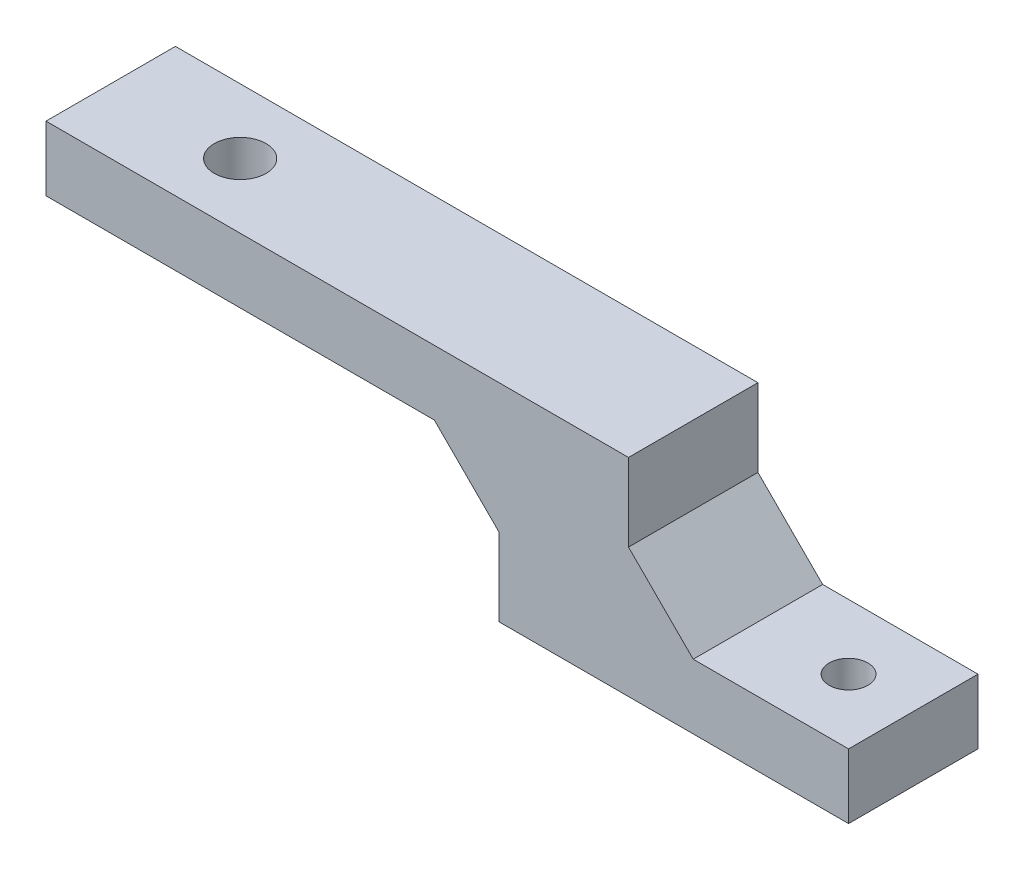
ISO-10303-21;
HEADER;
FILE_DESCRIPTION(('STEP AP214'),'2;1');
FILE_NAME('part.step','',(''),(''),'','','');
FILE_SCHEMA(('AUTOMOTIVE_DESIGN { 1 0 10303 214 1 1 1 1 }'));
ENDSEC;
DATA;
#1=APPLICATION_CONTEXT('core data for automotive mechanical design processes');
#2=APPLICATION_PROTOCOL_DEFINITION('international standard','automotive_design',2000,#1);
#3=PRODUCT_CONTEXT('',#1,'mechanical');
#4=PRODUCT('Part','Part','',(#3));
#5=PRODUCT_RELATED_PRODUCT_CATEGORY('part','',(#4));
#6=PRODUCT_DEFINITION_FORMATION('','',#4);
#7=PRODUCT_DEFINITION_CONTEXT('part definition',#1,'design');
#8=PRODUCT_DEFINITION('design','',#6,#7);
#9=PRODUCT_DEFINITION_SHAPE('','',#8);
#10=(LENGTH_UNIT() NAMED_UNIT(*) SI_UNIT(.MILLI.,.METRE.));
#11=(NAMED_UNIT(*) PLANE_ANGLE_UNIT() SI_UNIT($,.RADIAN.));
#12=(NAMED_UNIT(*) SI_UNIT($,.STERADIAN.) SOLID_ANGLE_UNIT());
#13=UNCERTAINTY_MEASURE_WITH_UNIT(LENGTH_MEASURE(1.E-05),#10,'distance_accuracy_value','');
#14=(GEOMETRIC_REPRESENTATION_CONTEXT(3) GLOBAL_UNCERTAINTY_ASSIGNED_CONTEXT((#13)) GLOBAL_UNIT_ASSIGNED_CONTEXT((#10,
#11,#12)) REPRESENTATION_CONTEXT('',''));
#15=CARTESIAN_POINT('',(0.,0.,0.));
#16=DIRECTION('',(0.,0.,1.));
#17=DIRECTION('',(1.,0.,0.));
#18=AXIS2_PLACEMENT_3D('',#15,#16,#17);
#19=CARTESIAN_POINT('',(0.,0.,10.));
#20=DIRECTION('',(1.,0.,0.));
#21=DIRECTION('',(0.,0.,-1.));
#22=AXIS2_PLACEMENT_3D('',#19,#20,#21);
#23=PLANE('',#22);
#24=DIRECTION('',(0.,-1.,0.));
#25=VECTOR('',#24,1.);
#26=CARTESIAN_POINT('',(0.,0.,0.));
#27=LINE('',#26,#25);
#28=CARTESIAN_POINT('',(0.,5.,0.));
#29=VERTEX_POINT('',#28);
#30=CARTESIAN_POINT('',(0.,0.,0.));
#31=VERTEX_POINT('',#30);
#32=EDGE_CURVE('E142',#29,#31,#27,.T.);
#33=ORIENTED_EDGE('',*,*,#32,.T.);
#34=DIRECTION('',(0.,0.,-1.));
#35=VECTOR('',#34,1.);
#36=CARTESIAN_POINT('',(0.,0.,10.));
#37=LINE('',#36,#35);
#38=CARTESIAN_POINT('',(0.,0.,10.));
#39=VERTEX_POINT('',#38);
#40=EDGE_CURVE('E123',#39,#31,#37,.T.);
#41=ORIENTED_EDGE('',*,*,#40,.F.);
#42=DIRECTION('',(0.,-1.,0.));
#43=VECTOR('',#42,1.);
#44=CARTESIAN_POINT('',(0.,0.,10.));
#45=LINE('',#44,#43);
#46=CARTESIAN_POINT('',(0.,5.,10.));
#47=VERTEX_POINT('',#46);
#48=EDGE_CURVE('E130',#47,#39,#45,.T.);
#49=ORIENTED_EDGE('',*,*,#48,.F.);
#50=DIRECTION('',(0.,0.,-1.));
#51=VECTOR('',#50,1.);
#52=CARTESIAN_POINT('',(0.,5.,10.));
#53=LINE('',#52,#51);
#54=EDGE_CURVE('E198',#47,#29,#53,.T.);
#55=ORIENTED_EDGE('',*,*,#54,.T.);
#56=EDGE_LOOP('',(#33,#41,#49,#55));
#57=FACE_BOUND('',#56,.T.);
#58=ADVANCED_FACE('F40',(#57),#23,.F.);
#59=CARTESIAN_POINT('',(0.,0.,10.));
#60=DIRECTION('',(0.,1.,0.));
#61=DIRECTION('',(0.,0.,1.));
#62=AXIS2_PLACEMENT_3D('',#59,#60,#61);
#63=PLANE('',#62);
#64=CARTESIAN_POINT('',(10.,0.,5.));
#65=DIRECTION('',(0.,1.,0.));
#66=DIRECTION('',(0.,0.,1.));
#67=AXIS2_PLACEMENT_3D('',#64,#65,#66);
#68=CIRCLE('',#67,2.);
#69=CARTESIAN_POINT('',(10.,0.,7.));
#70=VERTEX_POINT('',#69);
#71=EDGE_CURVE('E156',#70,#70,#68,.T.);
#72=ORIENTED_EDGE('',*,*,#71,.T.);
#73=EDGE_LOOP('',(#72));
#74=FACE_BOUND('',#73,.T.);
#75=DIRECTION('',(1.,0.,0.));
#76=VECTOR('',#75,1.);
#77=CARTESIAN_POINT('',(0.,0.,0.));
#78=LINE('',#77,#76);
#79=CARTESIAN_POINT('',(30.,0.,0.));
#80=VERTEX_POINT('',#79);
#81=EDGE_CURVE('E181',#31,#80,#78,.T.);
#82=ORIENTED_EDGE('',*,*,#81,.T.);
#83=DIRECTION('',(0.,0.,1.));
#84=VECTOR('',#83,1.);
#85=CARTESIAN_POINT('',(30.,0.,10.));
#86=LINE('',#85,#84);
#87=CARTESIAN_POINT('',(30.,0.,10.));
#88=VERTEX_POINT('',#87);
#89=EDGE_CURVE('E126',#80,#88,#86,.T.);
#90=ORIENTED_EDGE('',*,*,#89,.T.);
#91=DIRECTION('',(1.,0.,0.));
#92=VECTOR('',#91,1.);
#93=CARTESIAN_POINT('',(0.,0.,10.));
#94=LINE('',#93,#92);
#95=EDGE_CURVE('E118',#39,#88,#94,.T.);
#96=ORIENTED_EDGE('',*,*,#95,.F.);
#97=ORIENTED_EDGE('',*,*,#40,.T.);
#98=EDGE_LOOP('',(#82,#90,#96,#97));
#99=FACE_BOUND('',#98,.T.);
#100=ADVANCED_FACE('F121',(#74,#99),#63,.F.);
#101=CARTESIAN_POINT('',(35.,-11.,10.));
#102=DIRECTION('',(1.,0.,0.));
#103=DIRECTION('',(0.,0.,-1.));
#104=AXIS2_PLACEMENT_3D('',#101,#102,#103);
#105=PLANE('',#104);
#106=DIRECTION('',(0.,-1.,0.));
#107=VECTOR('',#106,1.);
#108=CARTESIAN_POINT('',(35.,-11.,10.));
#109=LINE('',#108,#107);
#110=CARTESIAN_POINT('',(35.,-5.00000000000004,10.));
#111=VERTEX_POINT('',#110);
#112=CARTESIAN_POINT('',(35.,-11.,10.));
#113=VERTEX_POINT('',#112);
#114=EDGE_CURVE('E129',#111,#113,#109,.T.);
#115=ORIENTED_EDGE('',*,*,#114,.F.);
#116=DIRECTION('',(0.,0.,-1.));
#117=VECTOR('',#116,1.);
#118=CARTESIAN_POINT('',(35.,-5.00000000000004,0.));
#119=LINE('',#118,#117);
#120=CARTESIAN_POINT('',(35.,-5.00000000000004,0.));
#121=VERTEX_POINT('',#120);
#122=EDGE_CURVE('E143',#111,#121,#119,.T.);
#123=ORIENTED_EDGE('',*,*,#122,.T.);
#124=DIRECTION('',(0.,-1.,0.));
#125=VECTOR('',#124,1.);
#126=CARTESIAN_POINT('',(35.,-11.,0.));
#127=LINE('',#126,#125);
#128=CARTESIAN_POINT('',(35.,-11.,0.));
#129=VERTEX_POINT('',#128);
#130=EDGE_CURVE('E183',#121,#129,#127,.T.);
#131=ORIENTED_EDGE('',*,*,#130,.T.);
#132=DIRECTION('',(0.,0.,-1.));
#133=VECTOR('',#132,1.);
#134=CARTESIAN_POINT('',(35.,-11.,10.));
#135=LINE('',#134,#133);
#136=EDGE_CURVE('E144',#113,#129,#135,.T.);
#137=ORIENTED_EDGE('',*,*,#136,.F.);
#138=EDGE_LOOP('',(#115,#123,#131,#137));
#139=FACE_BOUND('',#138,.T.);
#140=ADVANCED_FACE('F174',(#139),#105,.F.);
#141=CARTESIAN_POINT('',(62.,-11.,10.));
#142=DIRECTION('',(0.,1.,0.));
#143=DIRECTION('',(-1.,0.,0.));
#144=AXIS2_PLACEMENT_3D('',#141,#142,#143);
#145=PLANE('',#144);
#146=CARTESIAN_POINT('',(57.,-11.,5.));
#147=DIRECTION('',(0.,-1.,0.));
#148=DIRECTION('',(1.,0.,0.));
#149=AXIS2_PLACEMENT_3D('',#146,#147,#148);
#150=CIRCLE('',#149,1.5);
#151=CARTESIAN_POINT('',(58.5,-11.,5.));
#152=VERTEX_POINT('',#151);
#153=EDGE_CURVE('E157',#152,#152,#150,.T.);
#154=ORIENTED_EDGE('',*,*,#153,.F.);
#155=EDGE_LOOP('',(#154));
#156=FACE_BOUND('',#155,.T.);
#157=DIRECTION('',(1.,0.,0.));
#158=VECTOR('',#157,1.);
#159=CARTESIAN_POINT('',(62.,-11.,0.));
#160=LINE('',#159,#158);
#161=CARTESIAN_POINT('',(62.,-11.,0.));
#162=VERTEX_POINT('',#161);
#163=EDGE_CURVE('E185',#129,#162,#160,.T.);
#164=ORIENTED_EDGE('',*,*,#163,.T.);
#165=DIRECTION('',(0.,0.,-1.));
#166=VECTOR('',#165,1.);
#167=CARTESIAN_POINT('',(62.,-11.,10.));
#168=LINE('',#167,#166);
#169=CARTESIAN_POINT('',(62.,-11.,10.));
#170=VERTEX_POINT('',#169);
#171=EDGE_CURVE('E149',#170,#162,#168,.T.);
#172=ORIENTED_EDGE('',*,*,#171,.F.);
#173=DIRECTION('',(1.,0.,0.));
#174=VECTOR('',#173,1.);
#175=CARTESIAN_POINT('',(62.,-11.,10.));
#176=LINE('',#175,#174);
#177=EDGE_CURVE('E177',#113,#170,#176,.T.);
#178=ORIENTED_EDGE('',*,*,#177,.F.);
#179=ORIENTED_EDGE('',*,*,#136,.T.);
#180=EDGE_LOOP('',(#164,#172,#178,#179));
#181=FACE_BOUND('',#180,.T.);
#182=ADVANCED_FACE('F237',(#156,#181),#145,.F.);
#183=CARTESIAN_POINT('',(62.,-6.,10.));
#184=DIRECTION('',(-1.,0.,0.));
#185=DIRECTION('',(0.,0.,1.));
#186=AXIS2_PLACEMENT_3D('',#183,#184,#185);
#187=PLANE('',#186);
#188=DIRECTION('',(0.,1.,0.));
#189=VECTOR('',#188,1.);
#190=CARTESIAN_POINT('',(62.,-6.,0.));
#191=LINE('',#190,#189);
#192=CARTESIAN_POINT('',(62.,-6.,0.));
#193=VERTEX_POINT('',#192);
#194=EDGE_CURVE('E191',#162,#193,#191,.T.);
#195=ORIENTED_EDGE('',*,*,#194,.T.);
#196=DIRECTION('',(0.,0.,-1.));
#197=VECTOR('',#196,1.);
#198=CARTESIAN_POINT('',(62.,-6.,10.));
#199=LINE('',#198,#197);
#200=CARTESIAN_POINT('',(62.,-6.,10.));
#201=VERTEX_POINT('',#200);
#202=EDGE_CURVE('E203',#201,#193,#199,.T.);
#203=ORIENTED_EDGE('',*,*,#202,.F.);
#204=DIRECTION('',(0.,1.,0.));
#205=VECTOR('',#204,1.);
#206=CARTESIAN_POINT('',(62.,-6.,10.));
#207=LINE('',#206,#205);
#208=EDGE_CURVE('E212',#170,#201,#207,.T.);
#209=ORIENTED_EDGE('',*,*,#208,.F.);
#210=ORIENTED_EDGE('',*,*,#171,.T.);
#211=EDGE_LOOP('',(#195,#203,#209,#210));
#212=FACE_BOUND('',#211,.T.);
#213=ADVANCED_FACE('F210',(#212),#187,.F.);
#214=CARTESIAN_POINT('',(45.,-6.,10.));
#215=DIRECTION('',(0.,-1.,0.));
#216=DIRECTION('',(0.,0.,-1.));
#217=AXIS2_PLACEMENT_3D('',#214,#215,#216);
#218=PLANE('',#217);
#219=CARTESIAN_POINT('',(57.,-6.,5.));
#220=DIRECTION('',(0.,-1.,0.));
#221=DIRECTION('',(0.,0.,-1.));
#222=AXIS2_PLACEMENT_3D('',#219,#220,#221);
#223=CIRCLE('',#222,1.5);
#224=CARTESIAN_POINT('',(57.,-6.,3.5));
#225=VERTEX_POINT('',#224);
#226=EDGE_CURVE('E158',#225,#225,#223,.T.);
#227=ORIENTED_EDGE('',*,*,#226,.T.);
#228=EDGE_LOOP('',(#227));
#229=FACE_BOUND('',#228,.T.);
#230=DIRECTION('',(-1.,0.,0.));
#231=VECTOR('',#230,1.);
#232=CARTESIAN_POINT('',(45.,-6.,0.));
#233=LINE('',#232,#231);
#234=CARTESIAN_POINT('',(50.,-6.,0.));
#235=VERTEX_POINT('',#234);
#236=EDGE_CURVE('E193',#193,#235,#233,.T.);
#237=ORIENTED_EDGE('',*,*,#236,.T.);
#238=DIRECTION('',(0.,0.,1.));
#239=VECTOR('',#238,1.);
#240=CARTESIAN_POINT('',(50.,-6.,10.));
#241=LINE('',#240,#239);
#242=CARTESIAN_POINT('',(50.,-6.,10.));
#243=VERTEX_POINT('',#242);
#244=EDGE_CURVE('E56',#235,#243,#241,.T.);
#245=ORIENTED_EDGE('',*,*,#244,.T.);
#246=DIRECTION('',(-1.,0.,0.));
#247=VECTOR('',#246,1.);
#248=CARTESIAN_POINT('',(45.,-6.,10.));
#249=LINE('',#248,#247);
#250=EDGE_CURVE('E221',#201,#243,#249,.T.);
#251=ORIENTED_EDGE('',*,*,#250,.F.);
#252=ORIENTED_EDGE('',*,*,#202,.T.);
#253=EDGE_LOOP('',(#237,#245,#251,#252));
#254=FACE_BOUND('',#253,.T.);
#255=ADVANCED_FACE('F214',(#229,#254),#218,.F.);
#256=CARTESIAN_POINT('',(45.,5.,10.));
#257=DIRECTION('',(-1.,0.,0.));
#258=DIRECTION('',(0.,0.,1.));
#259=AXIS2_PLACEMENT_3D('',#256,#257,#258);
#260=PLANE('',#259);
#261=DIRECTION('',(0.,1.,0.));
#262=VECTOR('',#261,1.);
#263=CARTESIAN_POINT('',(45.,5.,10.));
#264=LINE('',#263,#262);
#265=CARTESIAN_POINT('',(45.,-0.999999999999974,10.));
#266=VERTEX_POINT('',#265);
#267=CARTESIAN_POINT('',(45.,5.,10.));
#268=VERTEX_POINT('',#267);
#269=EDGE_CURVE('E219',#266,#268,#264,.T.);
#270=ORIENTED_EDGE('',*,*,#269,.F.);
#271=DIRECTION('',(0.,0.,-1.));
#272=VECTOR('',#271,1.);
#273=CARTESIAN_POINT('',(45.,-0.999999999999974,0.));
#274=LINE('',#273,#272);
#275=CARTESIAN_POINT('',(45.,-0.999999999999974,0.));
#276=VERTEX_POINT('',#275);
#277=EDGE_CURVE('E162',#266,#276,#274,.T.);
#278=ORIENTED_EDGE('',*,*,#277,.T.);
#279=DIRECTION('',(0.,1.,0.));
#280=VECTOR('',#279,1.);
#281=CARTESIAN_POINT('',(45.,5.,0.));
#282=LINE('',#281,#280);
#283=CARTESIAN_POINT('',(45.,5.,0.));
#284=VERTEX_POINT('',#283);
#285=EDGE_CURVE('E195',#276,#284,#282,.T.);
#286=ORIENTED_EDGE('',*,*,#285,.T.);
#287=DIRECTION('',(0.,0.,-1.));
#288=VECTOR('',#287,1.);
#289=CARTESIAN_POINT('',(45.,5.,10.));
#290=LINE('',#289,#288);
#291=EDGE_CURVE('E200',#268,#284,#290,.T.);
#292=ORIENTED_EDGE('',*,*,#291,.F.);
#293=EDGE_LOOP('',(#270,#278,#286,#292));
#294=FACE_BOUND('',#293,.T.);
#295=ADVANCED_FACE('F223',(#294),#260,.F.);
#296=CARTESIAN_POINT('',(0.,5.,10.));
#297=DIRECTION('',(0.,-1.,0.));
#298=DIRECTION('',(0.,0.,-1.));
#299=AXIS2_PLACEMENT_3D('',#296,#297,#298);
#300=PLANE('',#299);
#301=CARTESIAN_POINT('',(10.,5.,5.));
#302=DIRECTION('',(0.,-1.,0.));
#303=DIRECTION('',(0.,0.,-1.));
#304=AXIS2_PLACEMENT_3D('',#301,#302,#303);
#305=CIRCLE('',#304,2.);
#306=CARTESIAN_POINT('',(10.,5.,3.));
#307=VERTEX_POINT('',#306);
#308=EDGE_CURVE('E153',#307,#307,#305,.T.);
#309=ORIENTED_EDGE('',*,*,#308,.T.);
#310=EDGE_LOOP('',(#309));
#311=FACE_BOUND('',#310,.T.);
#312=DIRECTION('',(-1.,0.,0.));
#313=VECTOR('',#312,1.);
#314=CARTESIAN_POINT('',(0.,5.,0.));
#315=LINE('',#314,#313);
#316=EDGE_CURVE('E139',#284,#29,#315,.T.);
#317=ORIENTED_EDGE('',*,*,#316,.T.);
#318=ORIENTED_EDGE('',*,*,#54,.F.);
#319=DIRECTION('',(-1.,0.,0.));
#320=VECTOR('',#319,1.);
#321=CARTESIAN_POINT('',(0.,5.,10.));
#322=LINE('',#321,#320);
#323=EDGE_CURVE('E135',#268,#47,#322,.T.);
#324=ORIENTED_EDGE('',*,*,#323,.F.);
#325=ORIENTED_EDGE('',*,*,#291,.T.);
#326=EDGE_LOOP('',(#317,#318,#324,#325));
#327=FACE_BOUND('',#326,.T.);
#328=ADVANCED_FACE('F271',(#311,#327),#300,.F.);
#329=CARTESIAN_POINT('',(0.,0.,10.));
#330=DIRECTION('',(0.,0.,-1.));
#331=DIRECTION('',(-1.,0.,0.));
#332=AXIS2_PLACEMENT_3D('',#329,#330,#331);
#333=PLANE('',#332);
#334=ORIENTED_EDGE('',*,*,#48,.T.);
#335=ORIENTED_EDGE('',*,*,#95,.T.);
#336=DIRECTION('',(-0.707106781186544,0.707106781186551,0.));
#337=VECTOR('',#336,1.);
#338=CARTESIAN_POINT('',(15.0000000000002,15.,10.));
#339=LINE('',#338,#337);
#340=EDGE_CURVE('E168',#88,#111,#339,.F.);
#341=ORIENTED_EDGE('',*,*,#340,.T.);
#342=ORIENTED_EDGE('',*,*,#114,.T.);
#343=ORIENTED_EDGE('',*,*,#177,.T.);
#344=ORIENTED_EDGE('',*,*,#208,.T.);
#345=ORIENTED_EDGE('',*,*,#250,.T.);
#346=DIRECTION('',(0.707106781186544,-0.707106781186551,0.));
#347=VECTOR('',#346,1.);
#348=CARTESIAN_POINT('',(22.0000000000002,22.,10.));
#349=LINE('',#348,#347);
#350=EDGE_CURVE('E11',#243,#266,#349,.F.);
#351=ORIENTED_EDGE('',*,*,#350,.T.);
#352=ORIENTED_EDGE('',*,*,#269,.T.);
#353=ORIENTED_EDGE('',*,*,#323,.T.);
#354=EDGE_LOOP('',(#334,#335,#341,#342,#343,#344,#345,#351,#352,#353));
#355=FACE_BOUND('',#354,.T.);
#356=ADVANCED_FACE('F133',(#355),#333,.F.);
#357=CARTESIAN_POINT('',(0.,0.,0.));
#358=DIRECTION('',(0.,0.,-1.));
#359=DIRECTION('',(-1.,0.,0.));
#360=AXIS2_PLACEMENT_3D('',#357,#358,#359);
#361=PLANE('',#360);
#362=ORIENTED_EDGE('',*,*,#32,.F.);
#363=ORIENTED_EDGE('',*,*,#316,.F.);
#364=ORIENTED_EDGE('',*,*,#285,.F.);
#365=DIRECTION('',(-0.707106781186544,0.707106781186551,0.));
#366=VECTOR('',#365,1.);
#367=CARTESIAN_POINT('',(45.,-0.999999999999974,0.));
#368=LINE('',#367,#366);
#369=EDGE_CURVE('E49',#276,#235,#368,.F.);
#370=ORIENTED_EDGE('',*,*,#369,.T.);
#371=ORIENTED_EDGE('',*,*,#236,.F.);
#372=ORIENTED_EDGE('',*,*,#194,.F.);
#373=ORIENTED_EDGE('',*,*,#163,.F.);
#374=ORIENTED_EDGE('',*,*,#130,.F.);
#375=DIRECTION('',(0.707106781186544,-0.707106781186551,0.));
#376=VECTOR('',#375,1.);
#377=CARTESIAN_POINT('',(35.,-5.00000000000004,0.));
#378=LINE('',#377,#376);
#379=EDGE_CURVE('E166',#121,#80,#378,.F.);
#380=ORIENTED_EDGE('',*,*,#379,.T.);
#381=ORIENTED_EDGE('',*,*,#81,.F.);
#382=EDGE_LOOP('',(#362,#363,#364,#370,#371,#372,#373,#374,#380,#381));
#383=FACE_BOUND('',#382,.T.);
#384=ADVANCED_FACE('F180',(#383),#361,.T.);
#385=CARTESIAN_POINT('',(10.,19.,5.));
#386=DIRECTION('',(0.,-1.,0.));
#387=DIRECTION('',(1.,0.,0.));
#388=AXIS2_PLACEMENT_3D('',#385,#386,#387);
#389=CYLINDRICAL_SURFACE('',#388,2.);
#390=ORIENTED_EDGE('',*,*,#308,.F.);
#391=EDGE_LOOP('',(#390));
#392=FACE_BOUND('',#391,.T.);
#393=ORIENTED_EDGE('',*,*,#71,.F.);
#394=EDGE_LOOP('',(#393));
#395=FACE_BOUND('',#394,.T.);
#396=ADVANCED_FACE('F261',(#392,#395),#389,.F.);
#397=CARTESIAN_POINT('',(57.,19.,5.));
#398=DIRECTION('',(0.,-1.,0.));
#399=DIRECTION('',(1.,0.,0.));
#400=AXIS2_PLACEMENT_3D('',#397,#398,#399);
#401=CYLINDRICAL_SURFACE('',#400,1.5);
#402=ORIENTED_EDGE('',*,*,#153,.T.);
#403=EDGE_LOOP('',(#402));
#404=FACE_BOUND('',#403,.T.);
#405=ORIENTED_EDGE('',*,*,#226,.F.);
#406=EDGE_LOOP('',(#405));
#407=FACE_BOUND('',#406,.T.);
#408=ADVANCED_FACE('F234',(#404,#407),#401,.F.);
#409=CARTESIAN_POINT('',(35.,-5.00000000000004,10.));
#410=DIRECTION('',(-0.707106781186551,-0.707106781186544,0.));
#411=DIRECTION('',(0.,0.,1.));
#412=AXIS2_PLACEMENT_3D('',#409,#410,#411);
#413=PLANE('',#412);
#414=ORIENTED_EDGE('',*,*,#340,.F.);
#415=ORIENTED_EDGE('',*,*,#89,.F.);
#416=ORIENTED_EDGE('',*,*,#379,.F.);
#417=ORIENTED_EDGE('',*,*,#122,.F.);
#418=EDGE_LOOP('',(#414,#415,#416,#417));
#419=FACE_BOUND('',#418,.T.);
#420=ADVANCED_FACE('F179',(#419),#413,.T.);
#421=CARTESIAN_POINT('',(45.,-0.999999999999974,10.));
#422=DIRECTION('',(0.707106781186551,0.707106781186544,0.));
#423=DIRECTION('',(0.,0.,1.));
#424=AXIS2_PLACEMENT_3D('',#421,#422,#423);
#425=PLANE('',#424);
#426=ORIENTED_EDGE('',*,*,#350,.F.);
#427=ORIENTED_EDGE('',*,*,#244,.F.);
#428=ORIENTED_EDGE('',*,*,#369,.F.);
#429=ORIENTED_EDGE('',*,*,#277,.F.);
#430=EDGE_LOOP('',(#426,#427,#428,#429));
#431=FACE_BOUND('',#430,.T.);
#432=ADVANCED_FACE('F43',(#431),#425,.T.);
#433=CLOSED_SHELL('',(#58,#100,#140,#182,#213,#255,#295,#328,#356,#384,#396,#408,#420,#432));
#434=MANIFOLD_SOLID_BREP('B2',#433);
#435=ADVANCED_BREP_SHAPE_REPRESENTATION('',(#18,#434),#14);
#436=SHAPE_DEFINITION_REPRESENTATION(#9,#435);
ENDSEC;
END-ISO-10303-21;
